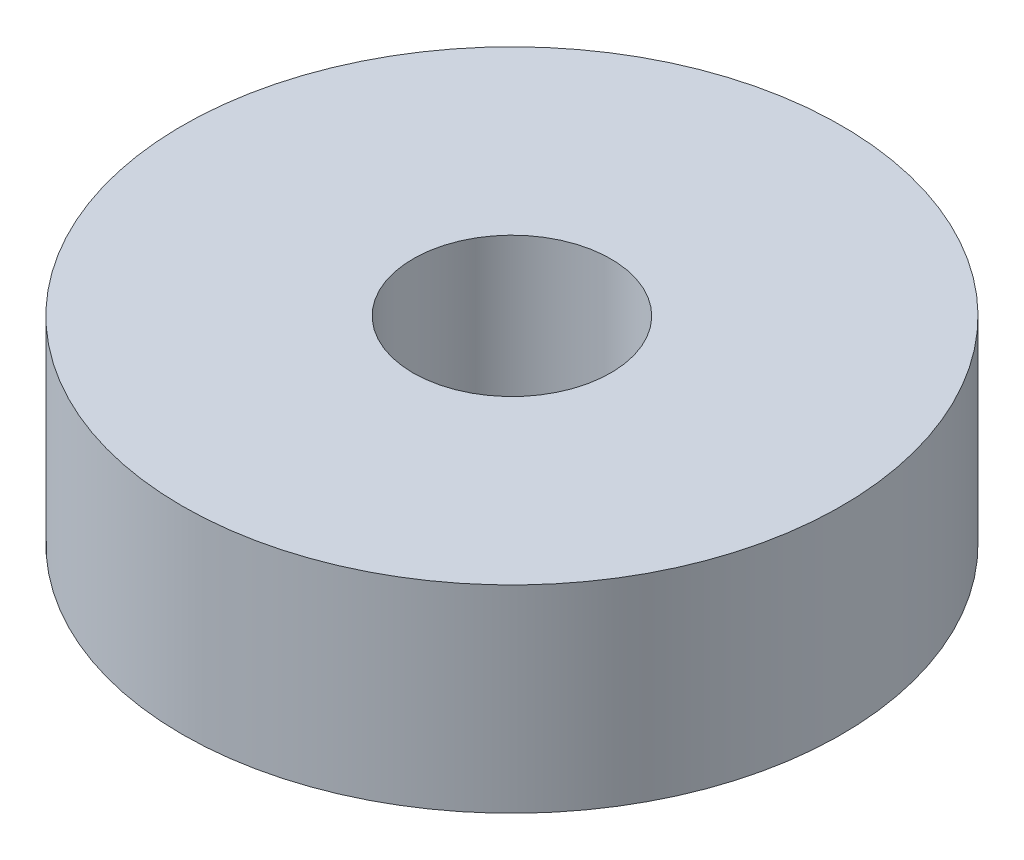
ISO-10303-21;
HEADER;
FILE_DESCRIPTION(('STEP AP214'),'2;1');
FILE_NAME('part.step','',(''),(''),'','','');
FILE_SCHEMA(('AUTOMOTIVE_DESIGN { 1 0 10303 214 1 1 1 1 }'));
ENDSEC;
DATA;
#1=APPLICATION_CONTEXT('core data for automotive mechanical design processes');
#2=APPLICATION_PROTOCOL_DEFINITION('international standard','automotive_design',2000,#1);
#3=PRODUCT_CONTEXT('',#1,'mechanical');
#4=PRODUCT('Part','Part','',(#3));
#5=PRODUCT_RELATED_PRODUCT_CATEGORY('part','',(#4));
#6=PRODUCT_DEFINITION_FORMATION('','',#4);
#7=PRODUCT_DEFINITION_CONTEXT('part definition',#1,'design');
#8=PRODUCT_DEFINITION('design','',#6,#7);
#9=PRODUCT_DEFINITION_SHAPE('','',#8);
#10=(LENGTH_UNIT() NAMED_UNIT(*) SI_UNIT(.MILLI.,.METRE.));
#11=(NAMED_UNIT(*) PLANE_ANGLE_UNIT() SI_UNIT($,.RADIAN.));
#12=(NAMED_UNIT(*) SI_UNIT($,.STERADIAN.) SOLID_ANGLE_UNIT());
#13=UNCERTAINTY_MEASURE_WITH_UNIT(LENGTH_MEASURE(1.E-05),#10,'distance_accuracy_value','');
#14=(GEOMETRIC_REPRESENTATION_CONTEXT(3) GLOBAL_UNCERTAINTY_ASSIGNED_CONTEXT((#13)) GLOBAL_UNIT_ASSIGNED_CONTEXT((#10,
#11,#12)) REPRESENTATION_CONTEXT('',''));
#15=CARTESIAN_POINT('',(0.,0.,0.));
#16=DIRECTION('',(0.,0.,1.));
#17=DIRECTION('',(1.,0.,0.));
#18=AXIS2_PLACEMENT_3D('',#15,#16,#17);
#19=CARTESIAN_POINT('',(0.,3.,0.));
#20=DIRECTION('',(0.,1.,0.));
#21=DIRECTION('',(0.,0.,1.));
#22=AXIS2_PLACEMENT_3D('',#19,#20,#21);
#23=PLANE('',#22);
#24=CARTESIAN_POINT('',(0.,3.,0.));
#25=DIRECTION('',(0.,1.,0.));
#26=DIRECTION('',(0.,0.,1.));
#27=AXIS2_PLACEMENT_3D('',#24,#25,#26);
#28=CIRCLE('',#27,5.);
#29=CARTESIAN_POINT('',(0.,3.,5.));
#30=VERTEX_POINT('',#29);
#31=EDGE_CURVE('E10',#30,#30,#28,.T.);
#32=ORIENTED_EDGE('',*,*,#31,.T.);
#33=EDGE_LOOP('',(#32));
#34=FACE_BOUND('',#33,.T.);
#35=CARTESIAN_POINT('',(0.,3.,0.));
#36=DIRECTION('',(0.,1.,0.));
#37=DIRECTION('',(0.,0.,1.));
#38=AXIS2_PLACEMENT_3D('',#35,#36,#37);
#39=CIRCLE('',#38,1.5);
#40=CARTESIAN_POINT('',(0.,3.,1.5));
#41=VERTEX_POINT('',#40);
#42=EDGE_CURVE('E56',#41,#41,#39,.T.);
#43=ORIENTED_EDGE('',*,*,#42,.F.);
#44=EDGE_LOOP('',(#43));
#45=FACE_BOUND('',#44,.T.);
#46=ADVANCED_FACE('F43',(#34,#45),#23,.T.);
#47=CARTESIAN_POINT('',(0.,0.,0.));
#48=DIRECTION('',(0.,1.,0.));
#49=DIRECTION('',(0.,0.,1.));
#50=AXIS2_PLACEMENT_3D('',#47,#48,#49);
#51=PLANE('',#50);
#52=CARTESIAN_POINT('',(0.,0.,0.));
#53=DIRECTION('',(0.,1.,0.));
#54=DIRECTION('',(0.,0.,1.));
#55=AXIS2_PLACEMENT_3D('',#52,#53,#54);
#56=CIRCLE('',#55,5.);
#57=CARTESIAN_POINT('',(0.,0.,5.));
#58=VERTEX_POINT('',#57);
#59=EDGE_CURVE('E47',#58,#58,#56,.T.);
#60=ORIENTED_EDGE('',*,*,#59,.F.);
#61=EDGE_LOOP('',(#60));
#62=FACE_BOUND('',#61,.T.);
#63=CARTESIAN_POINT('',(0.,0.,0.));
#64=DIRECTION('',(0.,1.,0.));
#65=DIRECTION('',(0.,0.,1.));
#66=AXIS2_PLACEMENT_3D('',#63,#64,#65);
#67=CIRCLE('',#66,1.5);
#68=CARTESIAN_POINT('',(0.,0.,1.5));
#69=VERTEX_POINT('',#68);
#70=EDGE_CURVE('E58',#69,#69,#67,.T.);
#71=ORIENTED_EDGE('',*,*,#70,.T.);
#72=EDGE_LOOP('',(#71));
#73=FACE_BOUND('',#72,.T.);
#74=ADVANCED_FACE('F70',(#62,#73),#51,.F.);
#75=CARTESIAN_POINT('',(0.,3.,0.));
#76=DIRECTION('',(0.,-1.,0.));
#77=DIRECTION('',(0.,0.,-1.));
#78=AXIS2_PLACEMENT_3D('',#75,#76,#77);
#79=CYLINDRICAL_SURFACE('',#78,5.);
#80=ORIENTED_EDGE('',*,*,#31,.F.);
#81=EDGE_LOOP('',(#80));
#82=FACE_BOUND('',#81,.T.);
#83=ORIENTED_EDGE('',*,*,#59,.T.);
#84=EDGE_LOOP('',(#83));
#85=FACE_BOUND('',#84,.T.);
#86=ADVANCED_FACE('F45',(#82,#85),#79,.T.);
#87=CARTESIAN_POINT('',(0.,3.,0.));
#88=DIRECTION('',(0.,-1.,0.));
#89=DIRECTION('',(0.,0.,-1.));
#90=AXIS2_PLACEMENT_3D('',#87,#88,#89);
#91=CYLINDRICAL_SURFACE('',#90,1.5);
#92=ORIENTED_EDGE('',*,*,#42,.T.);
#93=EDGE_LOOP('',(#92));
#94=FACE_BOUND('',#93,.T.);
#95=ORIENTED_EDGE('',*,*,#70,.F.);
#96=EDGE_LOOP('',(#95));
#97=FACE_BOUND('',#96,.T.);
#98=ADVANCED_FACE('F66',(#94,#97),#91,.F.);
#99=CLOSED_SHELL('',(#46,#74,#86,#98));
#100=MANIFOLD_SOLID_BREP('B2',#99);
#101=ADVANCED_BREP_SHAPE_REPRESENTATION('',(#18,#100),#14);
#102=SHAPE_DEFINITION_REPRESENTATION(#9,#101);
ENDSEC;
END-ISO-10303-21;
